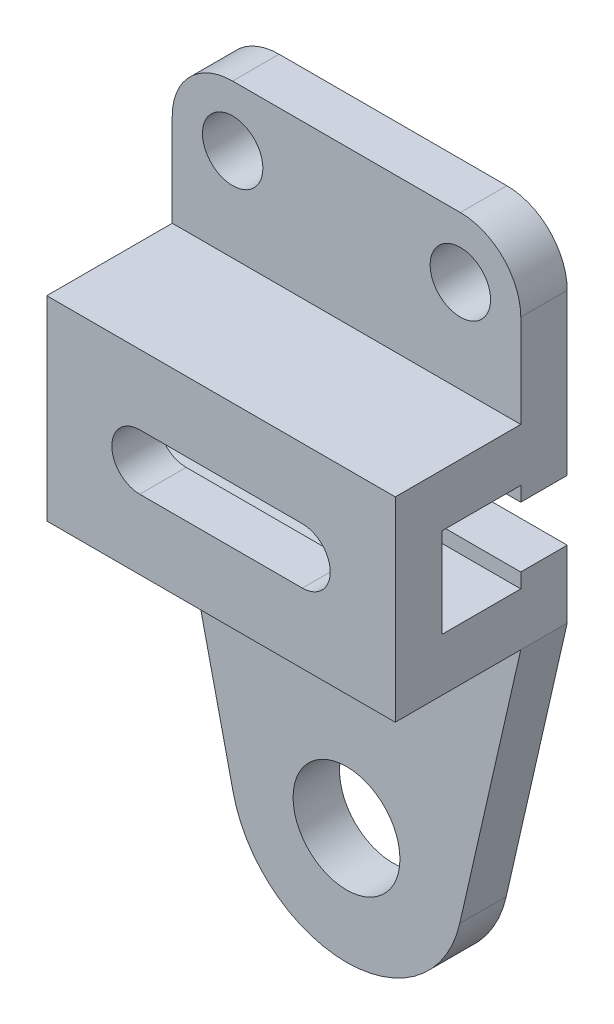
ISO-10303-21;
HEADER;
FILE_DESCRIPTION(('STEP AP214'),'2;1');
FILE_NAME('part.step','',(''),(''),'','','');
FILE_SCHEMA(('AUTOMOTIVE_DESIGN { 1 0 10303 214 1 1 1 1 }'));
ENDSEC;
DATA;
#1=APPLICATION_CONTEXT('core data for automotive mechanical design processes');
#2=APPLICATION_PROTOCOL_DEFINITION('international standard','automotive_design',2000,#1);
#3=PRODUCT_CONTEXT('',#1,'mechanical');
#4=PRODUCT('Part','Part','',(#3));
#5=PRODUCT_RELATED_PRODUCT_CATEGORY('part','',(#4));
#6=PRODUCT_DEFINITION_FORMATION('','',#4);
#7=PRODUCT_DEFINITION_CONTEXT('part definition',#1,'design');
#8=PRODUCT_DEFINITION('design','',#6,#7);
#9=PRODUCT_DEFINITION_SHAPE('','',#8);
#10=(LENGTH_UNIT() NAMED_UNIT(*) SI_UNIT(.MILLI.,.METRE.));
#11=(NAMED_UNIT(*) PLANE_ANGLE_UNIT() SI_UNIT($,.RADIAN.));
#12=(NAMED_UNIT(*) SI_UNIT($,.STERADIAN.) SOLID_ANGLE_UNIT());
#13=UNCERTAINTY_MEASURE_WITH_UNIT(LENGTH_MEASURE(1.E-05),#10,'distance_accuracy_value','');
#14=(GEOMETRIC_REPRESENTATION_CONTEXT(3) GLOBAL_UNCERTAINTY_ASSIGNED_CONTEXT((#13)) GLOBAL_UNIT_ASSIGNED_CONTEXT((#10,
#11,#12)) REPRESENTATION_CONTEXT('',''));
#15=CARTESIAN_POINT('',(0.,0.,0.));
#16=DIRECTION('',(0.,0.,1.));
#17=DIRECTION('',(1.,0.,0.));
#18=AXIS2_PLACEMENT_3D('',#15,#16,#17);
#19=CARTESIAN_POINT('',(37.5,-98.,-8.49999999999997));
#20=DIRECTION('',(0.,0.,-1.));
#21=DIRECTION('',(-1.,0.,0.));
#22=AXIS2_PLACEMENT_3D('',#19,#20,#21);
#23=PLANE('',#22);
#24=CARTESIAN_POINT('',(0.,-73.,-8.49999999999997));
#25=DIRECTION('',(0.,0.,-1.));
#26=DIRECTION('',(-1.,0.,0.));
#27=AXIS2_PLACEMENT_3D('',#24,#25,#26);
#28=CIRCLE('',#27,11.5);
#29=CARTESIAN_POINT('',(-11.5,-73.,-8.49999999999997));
#30=VERTEX_POINT('',#29);
#31=EDGE_CURVE('E423',#30,#30,#28,.T.);
#32=ORIENTED_EDGE('',*,*,#31,.T.);
#33=EDGE_LOOP('',(#32));
#34=FACE_BOUND('',#33,.T.);
#35=DIRECTION('',(-0.222334462281461,0.974970454363625,0.));
#36=VECTOR('',#35,1.);
#37=CARTESIAN_POINT('',(-17.1013000743849,-110.451403668259,-8.49999999999997));
#38=LINE('',#37,#36);
#39=CARTESIAN_POINT('',(-24.3742613590906,-78.5583615570365,-8.49999999999997));
#40=VERTEX_POINT('',#39);
#41=CARTESIAN_POINT('',(-37.5,-21.,-8.49999999999997));
#42=VERTEX_POINT('',#41);
#43=EDGE_CURVE('E12',#40,#42,#38,.T.);
#44=ORIENTED_EDGE('',*,*,#43,.F.);
#45=CARTESIAN_POINT('',(0.,-73.,-8.49999999999997));
#46=DIRECTION('',(0.,0.,-1.));
#47=DIRECTION('',(-1.,0.,0.));
#48=AXIS2_PLACEMENT_3D('',#45,#46,#47);
#49=CIRCLE('',#48,25.);
#50=CARTESIAN_POINT('',(24.3742613590906,-78.5583615570365,-8.49999999999997));
#51=VERTEX_POINT('',#50);
#52=EDGE_CURVE('E161',#51,#40,#49,.T.);
#53=ORIENTED_EDGE('',*,*,#52,.F.);
#54=DIRECTION('',(0.22233446228146,0.974970454363625,0.));
#55=VECTOR('',#54,1.);
#56=CARTESIAN_POINT('',(20.8087460582339,-94.1936887899151,-8.49999999999997));
#57=LINE('',#56,#55);
#58=CARTESIAN_POINT('',(37.5,-21.,-8.49999999999997));
#59=VERTEX_POINT('',#58);
#60=EDGE_CURVE('E397',#51,#59,#57,.T.);
#61=ORIENTED_EDGE('',*,*,#60,.T.);
#62=DIRECTION('',(-1.,0.,0.));
#63=VECTOR('',#62,1.);
#64=CARTESIAN_POINT('',(37.5,-21.,-8.49999999999997));
#65=LINE('',#64,#63);
#66=EDGE_CURVE('E381',#59,#42,#65,.T.);
#67=ORIENTED_EDGE('',*,*,#66,.T.);
#68=EDGE_LOOP('',(#44,#53,#61,#67));
#69=FACE_BOUND('',#68,.T.);
#70=ADVANCED_FACE('F149',(#34,#69),#23,.F.);
#71=CARTESIAN_POINT('',(37.5,-21.,-18.5));
#72=DIRECTION('',(0.,0.,1.));
#73=DIRECTION('',(0.,-1.,0.));
#74=AXIS2_PLACEMENT_3D('',#71,#72,#73);
#75=PLANE('',#74);
#76=CARTESIAN_POINT('',(0.,-73.,-18.5000000000001));
#77=DIRECTION('',(0.,0.,1.));
#78=DIRECTION('',(1.,0.,0.));
#79=AXIS2_PLACEMENT_3D('',#76,#77,#78);
#80=CIRCLE('',#79,11.5);
#81=CARTESIAN_POINT('',(11.5,-73.,-18.5000000000001));
#82=VERTEX_POINT('',#81);
#83=EDGE_CURVE('E490',#82,#82,#80,.T.);
#84=ORIENTED_EDGE('',*,*,#83,.T.);
#85=EDGE_LOOP('',(#84));
#86=FACE_BOUND('',#85,.T.);
#87=CARTESIAN_POINT('',(0.,-73.,-18.5000000000001));
#88=DIRECTION('',(0.,0.,1.));
#89=DIRECTION('',(1.,0.,0.));
#90=AXIS2_PLACEMENT_3D('',#87,#88,#89);
#91=CIRCLE('',#90,25.);
#92=CARTESIAN_POINT('',(-24.3742613590906,-78.5583615570365,-18.5000000000001));
#93=VERTEX_POINT('',#92);
#94=CARTESIAN_POINT('',(24.3742613590906,-78.5583615570365,-18.5000000000001));
#95=VERTEX_POINT('',#94);
#96=EDGE_CURVE('E424',#93,#95,#91,.T.);
#97=ORIENTED_EDGE('',*,*,#96,.F.);
#98=DIRECTION('',(0.222334462281461,-0.974970454363625,0.));
#99=VECTOR('',#98,1.);
#100=CARTESIAN_POINT('',(-40.1984371740117,-9.16694231464952,-18.5000000000001));
#101=LINE('',#100,#99);
#102=CARTESIAN_POINT('',(-37.5,-21.,-18.5000000000001));
#103=VERTEX_POINT('',#102);
#104=EDGE_CURVE('E477',#103,#93,#101,.T.);
#105=ORIENTED_EDGE('',*,*,#104,.F.);
#106=DIRECTION('',(0.,1.,0.));
#107=VECTOR('',#106,1.);
#108=CARTESIAN_POINT('',(-37.5,-21.,-18.5));
#109=LINE('',#108,#107);
#110=CARTESIAN_POINT('',(-37.5,-6.5,-18.5000000000001));
#111=VERTEX_POINT('',#110);
#112=EDGE_CURVE('E342',#103,#111,#109,.T.);
#113=ORIENTED_EDGE('',*,*,#112,.T.);
#114=DIRECTION('',(-1.,0.,0.));
#115=VECTOR('',#114,1.);
#116=CARTESIAN_POINT('',(37.5,-6.5,-18.5000000000001));
#117=LINE('',#116,#115);
#118=CARTESIAN_POINT('',(37.5,-6.5,-18.5000000000001));
#119=VERTEX_POINT('',#118);
#120=EDGE_CURVE('E379',#119,#111,#117,.T.);
#121=ORIENTED_EDGE('',*,*,#120,.F.);
#122=DIRECTION('',(0.,1.,0.));
#123=VECTOR('',#122,1.);
#124=CARTESIAN_POINT('',(37.5,-21.,-18.5));
#125=LINE('',#124,#123);
#126=CARTESIAN_POINT('',(37.5,-21.,-18.5000000000001));
#127=VERTEX_POINT('',#126);
#128=EDGE_CURVE('E449',#127,#119,#125,.T.);
#129=ORIENTED_EDGE('',*,*,#128,.F.);
#130=DIRECTION('',(-0.22233446228146,-0.974970454363625,0.));
#131=VECTOR('',#130,1.);
#132=CARTESIAN_POINT('',(40.1984371740117,-9.1669423146495,-18.5000000000001));
#133=LINE('',#132,#131);
#134=EDGE_CURVE('E429',#127,#95,#133,.T.);
#135=ORIENTED_EDGE('',*,*,#134,.T.);
#136=EDGE_LOOP('',(#97,#105,#113,#121,#129,#135));
#137=FACE_BOUND('',#136,.T.);
#138=ADVANCED_FACE('F518',(#86,#137),#75,.F.);
#139=CARTESIAN_POINT('',(37.5,54.,-18.5));
#140=DIRECTION('',(0.,0.,1.));
#141=DIRECTION('',(1.,0.,0.));
#142=AXIS2_PLACEMENT_3D('',#139,#140,#141);
#143=PLANE('',#142);
#144=CARTESIAN_POINT('',(-24.5,41.,-18.5000000000001));
#145=DIRECTION('',(0.,0.,1.));
#146=DIRECTION('',(1.,0.,0.));
#147=AXIS2_PLACEMENT_3D('',#144,#145,#146);
#148=CIRCLE('',#147,6.5);
#149=CARTESIAN_POINT('',(-18.,41.,-18.5000000000001));
#150=VERTEX_POINT('',#149);
#151=EDGE_CURVE('E480',#150,#150,#148,.F.);
#152=ORIENTED_EDGE('',*,*,#151,.F.);
#153=EDGE_LOOP('',(#152));
#154=FACE_BOUND('',#153,.T.);
#155=CARTESIAN_POINT('',(24.5,41.,-18.5000000000001));
#156=DIRECTION('',(0.,0.,1.));
#157=DIRECTION('',(1.,0.,0.));
#158=AXIS2_PLACEMENT_3D('',#155,#156,#157);
#159=CIRCLE('',#158,6.5);
#160=CARTESIAN_POINT('',(31.,41.,-18.5000000000001));
#161=VERTEX_POINT('',#160);
#162=EDGE_CURVE('E492',#161,#161,#159,.T.);
#163=ORIENTED_EDGE('',*,*,#162,.T.);
#164=EDGE_LOOP('',(#163));
#165=FACE_BOUND('',#164,.T.);
#166=CARTESIAN_POINT('',(24.5,41.,-18.5000000000001));
#167=DIRECTION('',(0.,0.,1.));
#168=DIRECTION('',(1.,0.,0.));
#169=AXIS2_PLACEMENT_3D('',#166,#167,#168);
#170=CIRCLE('',#169,13.);
#171=CARTESIAN_POINT('',(37.5,41.,-18.5000000000001));
#172=VERTEX_POINT('',#171);
#173=CARTESIAN_POINT('',(24.5,54.,-18.5000000000001));
#174=VERTEX_POINT('',#173);
#175=EDGE_CURVE('E469',#172,#174,#170,.T.);
#176=ORIENTED_EDGE('',*,*,#175,.F.);
#177=DIRECTION('',(0.,1.,0.));
#178=VECTOR('',#177,1.);
#179=CARTESIAN_POINT('',(37.5,6.5,-18.5000000000001));
#180=LINE('',#179,#178);
#181=CARTESIAN_POINT('',(37.5,6.5,-18.5000000000001));
#182=VERTEX_POINT('',#181);
#183=EDGE_CURVE('E359',#182,#172,#180,.T.);
#184=ORIENTED_EDGE('',*,*,#183,.F.);
#185=DIRECTION('',(-1.,0.,0.));
#186=VECTOR('',#185,1.);
#187=CARTESIAN_POINT('',(37.5,6.5,-18.5000000000001));
#188=LINE('',#187,#186);
#189=CARTESIAN_POINT('',(-37.5,6.5,-18.5000000000001));
#190=VERTEX_POINT('',#189);
#191=EDGE_CURVE('E329',#182,#190,#188,.T.);
#192=ORIENTED_EDGE('',*,*,#191,.T.);
#193=DIRECTION('',(0.,1.,0.));
#194=VECTOR('',#193,1.);
#195=CARTESIAN_POINT('',(-37.5,54.,-18.5));
#196=LINE('',#195,#194);
#197=CARTESIAN_POINT('',(-37.5,41.,-18.5000000000001));
#198=VERTEX_POINT('',#197);
#199=EDGE_CURVE('E317',#190,#198,#196,.T.);
#200=ORIENTED_EDGE('',*,*,#199,.T.);
#201=CARTESIAN_POINT('',(-24.5,41.,-18.5000000000001));
#202=DIRECTION('',(0.,0.,1.));
#203=DIRECTION('',(1.,0.,0.));
#204=AXIS2_PLACEMENT_3D('',#201,#202,#203);
#205=CIRCLE('',#204,13.);
#206=CARTESIAN_POINT('',(-24.5,54.,-18.5000000000001));
#207=VERTEX_POINT('',#206);
#208=EDGE_CURVE('E301',#198,#207,#205,.F.);
#209=ORIENTED_EDGE('',*,*,#208,.T.);
#210=DIRECTION('',(-1.,0.,0.));
#211=VECTOR('',#210,1.);
#212=CARTESIAN_POINT('',(37.5,54.,-18.5));
#213=LINE('',#212,#211);
#214=EDGE_CURVE('E396',#174,#207,#213,.T.);
#215=ORIENTED_EDGE('',*,*,#214,.F.);
#216=EDGE_LOOP('',(#176,#184,#192,#200,#209,#215));
#217=FACE_BOUND('',#216,.T.);
#218=ADVANCED_FACE('F148',(#154,#165,#217),#143,.F.);
#219=CARTESIAN_POINT('',(37.5,54.,-8.49999999999997));
#220=DIRECTION('',(0.,-1.,0.));
#221=DIRECTION('',(0.,0.,-1.));
#222=AXIS2_PLACEMENT_3D('',#219,#220,#221);
#223=PLANE('',#222);
#224=DIRECTION('',(0.,0.,1.));
#225=VECTOR('',#224,1.);
#226=CARTESIAN_POINT('',(24.5,54.,-18.5000000000001));
#227=LINE('',#226,#225);
#228=CARTESIAN_POINT('',(24.5,54.,-8.49999999999997));
#229=VERTEX_POINT('',#228);
#230=EDGE_CURVE('E173',#174,#229,#227,.T.);
#231=ORIENTED_EDGE('',*,*,#230,.F.);
#232=ORIENTED_EDGE('',*,*,#214,.T.);
#233=DIRECTION('',(0.,0.,1.));
#234=VECTOR('',#233,1.);
#235=CARTESIAN_POINT('',(-24.5,54.,-18.5000000000001));
#236=LINE('',#235,#234);
#237=CARTESIAN_POINT('',(-24.5,54.,-8.49999999999997));
#238=VERTEX_POINT('',#237);
#239=EDGE_CURVE('E309',#207,#238,#236,.T.);
#240=ORIENTED_EDGE('',*,*,#239,.T.);
#241=DIRECTION('',(-1.,0.,0.));
#242=VECTOR('',#241,1.);
#243=CARTESIAN_POINT('',(37.5,54.,-8.49999999999997));
#244=LINE('',#243,#242);
#245=EDGE_CURVE('E394',#229,#238,#244,.T.);
#246=ORIENTED_EDGE('',*,*,#245,.F.);
#247=EDGE_LOOP('',(#231,#232,#240,#246));
#248=FACE_BOUND('',#247,.T.);
#249=ADVANCED_FACE('F519',(#248),#223,.F.);
#250=CARTESIAN_POINT('',(37.5,21.,-8.49999999999997));
#251=DIRECTION('',(0.,0.,-1.));
#252=DIRECTION('',(-1.,0.,0.));
#253=AXIS2_PLACEMENT_3D('',#250,#251,#252);
#254=PLANE('',#253);
#255=CARTESIAN_POINT('',(24.5,41.,-8.49999999999997));
#256=DIRECTION('',(0.,0.,-1.));
#257=DIRECTION('',(-1.,0.,0.));
#258=AXIS2_PLACEMENT_3D('',#255,#256,#257);
#259=CIRCLE('',#258,6.5);
#260=CARTESIAN_POINT('',(18.,41.,-8.49999999999997));
#261=VERTEX_POINT('',#260);
#262=EDGE_CURVE('E414',#261,#261,#259,.T.);
#263=ORIENTED_EDGE('',*,*,#262,.T.);
#264=EDGE_LOOP('',(#263));
#265=FACE_BOUND('',#264,.T.);
#266=CARTESIAN_POINT('',(24.5,41.,-8.49999999999997));
#267=DIRECTION('',(0.,0.,-1.));
#268=DIRECTION('',(-1.,0.,0.));
#269=AXIS2_PLACEMENT_3D('',#266,#267,#268);
#270=CIRCLE('',#269,13.);
#271=CARTESIAN_POINT('',(37.5,41.,-8.49999999999997));
#272=VERTEX_POINT('',#271);
#273=EDGE_CURVE('E157',#229,#272,#270,.T.);
#274=ORIENTED_EDGE('',*,*,#273,.F.);
#275=ORIENTED_EDGE('',*,*,#245,.T.);
#276=CARTESIAN_POINT('',(-24.5,41.,-8.49999999999997));
#277=DIRECTION('',(0.,0.,-1.));
#278=DIRECTION('',(-1.,0.,0.));
#279=AXIS2_PLACEMENT_3D('',#276,#277,#278);
#280=CIRCLE('',#279,13.);
#281=CARTESIAN_POINT('',(-37.5,41.,-8.49999999999997));
#282=VERTEX_POINT('',#281);
#283=EDGE_CURVE('E416',#238,#282,#280,.F.);
#284=ORIENTED_EDGE('',*,*,#283,.T.);
#285=DIRECTION('',(0.,-1.,0.));
#286=VECTOR('',#285,1.);
#287=CARTESIAN_POINT('',(-37.5,21.,-8.49999999999997));
#288=LINE('',#287,#286);
#289=CARTESIAN_POINT('',(-37.5,21.,-8.49999999999997));
#290=VERTEX_POINT('',#289);
#291=EDGE_CURVE('E325',#282,#290,#288,.T.);
#292=ORIENTED_EDGE('',*,*,#291,.T.);
#293=DIRECTION('',(-1.,0.,0.));
#294=VECTOR('',#293,1.);
#295=CARTESIAN_POINT('',(37.5,21.,-8.49999999999997));
#296=LINE('',#295,#294);
#297=CARTESIAN_POINT('',(37.5,21.,-8.49999999999997));
#298=VERTEX_POINT('',#297);
#299=EDGE_CURVE('E392',#298,#290,#296,.T.);
#300=ORIENTED_EDGE('',*,*,#299,.F.);
#301=DIRECTION('',(0.,-1.,0.));
#302=VECTOR('',#301,1.);
#303=CARTESIAN_POINT('',(37.5,21.,-8.49999999999997));
#304=LINE('',#303,#302);
#305=EDGE_CURVE('E443',#272,#298,#304,.T.);
#306=ORIENTED_EDGE('',*,*,#305,.F.);
#307=EDGE_LOOP('',(#274,#275,#284,#292,#300,#306));
#308=FACE_BOUND('',#307,.T.);
#309=CARTESIAN_POINT('',(-24.5,41.,-8.49999999999997));
#310=DIRECTION('',(0.,0.,-1.));
#311=DIRECTION('',(-1.,0.,0.));
#312=AXIS2_PLACEMENT_3D('',#309,#310,#311);
#313=CIRCLE('',#312,6.5);
#314=CARTESIAN_POINT('',(-31.,41.,-8.49999999999997));
#315=VERTEX_POINT('',#314);
#316=EDGE_CURVE('E419',#315,#315,#313,.F.);
#317=ORIENTED_EDGE('',*,*,#316,.F.);
#318=EDGE_LOOP('',(#317));
#319=FACE_BOUND('',#318,.T.);
#320=ADVANCED_FACE('F524',(#265,#308,#319),#254,.F.);
#321=CARTESIAN_POINT('',(-37.5,0.,0.));
#322=DIRECTION('',(-1.,0.,0.));
#323=DIRECTION('',(0.,0.,1.));
#324=AXIS2_PLACEMENT_3D('',#321,#322,#323);
#325=PLANE('',#324);
#326=DIRECTION('',(0.,0.,1.));
#327=VECTOR('',#326,1.);
#328=CARTESIAN_POINT('',(-37.5,41.,-18.5000000000001));
#329=LINE('',#328,#327);
#330=EDGE_CURVE('E308',#198,#282,#329,.T.);
#331=ORIENTED_EDGE('',*,*,#330,.F.);
#332=ORIENTED_EDGE('',*,*,#199,.F.);
#333=DIRECTION('',(0.,0.,-1.));
#334=VECTOR('',#333,1.);
#335=CARTESIAN_POINT('',(-37.5,6.5,-8.49999999999991));
#336=LINE('',#335,#334);
#337=CARTESIAN_POINT('',(-37.5,6.5,-8.49999999999991));
#338=VERTEX_POINT('',#337);
#339=EDGE_CURVE('E358',#338,#190,#336,.T.);
#340=ORIENTED_EDGE('',*,*,#339,.F.);
#341=DIRECTION('',(0.,-1.,0.));
#342=VECTOR('',#341,1.);
#343=CARTESIAN_POINT('',(-37.5,6.5,-8.49999999999991));
#344=LINE('',#343,#342);
#345=CARTESIAN_POINT('',(-37.5,9.64864864864867,-8.49999999999997));
#346=VERTEX_POINT('',#345);
#347=EDGE_CURVE('E356',#346,#338,#344,.T.);
#348=ORIENTED_EDGE('',*,*,#347,.F.);
#349=DIRECTION('',(0.,0.,-1.));
#350=VECTOR('',#349,1.);
#351=CARTESIAN_POINT('',(-37.5,9.64864864864867,8.49999999999997));
#352=LINE('',#351,#350);
#353=CARTESIAN_POINT('',(-37.5,9.64864864864867,8.49999999999997));
#354=VERTEX_POINT('',#353);
#355=EDGE_CURVE('E354',#354,#346,#352,.T.);
#356=ORIENTED_EDGE('',*,*,#355,.F.);
#357=DIRECTION('',(0.,1.,0.));
#358=VECTOR('',#357,1.);
#359=CARTESIAN_POINT('',(-37.5,-9.64864864864868,8.49999999999997));
#360=LINE('',#359,#358);
#361=CARTESIAN_POINT('',(-37.5,-9.64864864864868,8.49999999999997));
#362=VERTEX_POINT('',#361);
#363=EDGE_CURVE('E355',#362,#354,#360,.T.);
#364=ORIENTED_EDGE('',*,*,#363,.F.);
#365=DIRECTION('',(0.,0.,1.));
#366=VECTOR('',#365,1.);
#367=CARTESIAN_POINT('',(-37.5,-9.64864864864868,8.49999999999997));
#368=LINE('',#367,#366);
#369=CARTESIAN_POINT('',(-37.5,-9.64864864864868,-8.49999999999997));
#370=VERTEX_POINT('',#369);
#371=EDGE_CURVE('E349',#370,#362,#368,.T.);
#372=ORIENTED_EDGE('',*,*,#371,.F.);
#373=DIRECTION('',(0.,-1.,0.));
#374=VECTOR('',#373,1.);
#375=CARTESIAN_POINT('',(-37.5,-9.64864864864868,-8.49999999999997));
#376=LINE('',#375,#374);
#377=CARTESIAN_POINT('',(-37.5,-6.5,-8.49999999999991));
#378=VERTEX_POINT('',#377);
#379=EDGE_CURVE('E346',#378,#370,#376,.T.);
#380=ORIENTED_EDGE('',*,*,#379,.F.);
#381=DIRECTION('',(0.,0.,1.));
#382=VECTOR('',#381,1.);
#383=CARTESIAN_POINT('',(-37.5,-6.5,-8.49999999999991));
#384=LINE('',#383,#382);
#385=EDGE_CURVE('E348',#111,#378,#384,.T.);
#386=ORIENTED_EDGE('',*,*,#385,.F.);
#387=ORIENTED_EDGE('',*,*,#112,.F.);
#388=DIRECTION('',(0.,0.,1.));
#389=VECTOR('',#388,1.);
#390=CARTESIAN_POINT('',(-37.5,-21.,-18.5000000000001));
#391=LINE('',#390,#389);
#392=EDGE_CURVE('E485',#103,#42,#391,.T.);
#393=ORIENTED_EDGE('',*,*,#392,.T.);
#394=DIRECTION('',(0.,0.,-1.));
#395=VECTOR('',#394,1.);
#396=CARTESIAN_POINT('',(-37.5,-21.,18.5));
#397=LINE('',#396,#395);
#398=CARTESIAN_POINT('',(-37.5,-21.,18.5));
#399=VERTEX_POINT('',#398);
#400=EDGE_CURVE('E343',#399,#42,#397,.T.);
#401=ORIENTED_EDGE('',*,*,#400,.F.);
#402=DIRECTION('',(0.,-1.,0.));
#403=VECTOR('',#402,1.);
#404=CARTESIAN_POINT('',(-37.5,-21.,18.5));
#405=LINE('',#404,#403);
#406=CARTESIAN_POINT('',(-37.5,21.,18.5));
#407=VERTEX_POINT('',#406);
#408=EDGE_CURVE('E339',#407,#399,#405,.T.);
#409=ORIENTED_EDGE('',*,*,#408,.F.);
#410=DIRECTION('',(0.,0.,1.));
#411=VECTOR('',#410,1.);
#412=CARTESIAN_POINT('',(-37.5,21.,18.5));
#413=LINE('',#412,#411);
#414=EDGE_CURVE('E328',#290,#407,#413,.T.);
#415=ORIENTED_EDGE('',*,*,#414,.F.);
#416=ORIENTED_EDGE('',*,*,#291,.F.);
#417=EDGE_LOOP('',(#331,#332,#340,#348,#356,#364,#372,#380,#386,#387,#393,#401,#409,#415,#416));
#418=FACE_BOUND('',#417,.T.);
#419=ADVANCED_FACE('F320',(#418),#325,.T.);
#420=CARTESIAN_POINT('',(37.5,0.,0.));
#421=DIRECTION('',(-1.,0.,0.));
#422=DIRECTION('',(0.,0.,1.));
#423=AXIS2_PLACEMENT_3D('',#420,#421,#422);
#424=PLANE('',#423);
#425=ORIENTED_EDGE('',*,*,#183,.T.);
#426=DIRECTION('',(0.,0.,1.));
#427=VECTOR('',#426,1.);
#428=CARTESIAN_POINT('',(37.5,41.,-18.5000000000001));
#429=LINE('',#428,#427);
#430=EDGE_CURVE('E472',#172,#272,#429,.T.);
#431=ORIENTED_EDGE('',*,*,#430,.T.);
#432=ORIENTED_EDGE('',*,*,#305,.T.);
#433=DIRECTION('',(0.,0.,1.));
#434=VECTOR('',#433,1.);
#435=CARTESIAN_POINT('',(37.5,21.,18.5));
#436=LINE('',#435,#434);
#437=CARTESIAN_POINT('',(37.5,21.,18.5));
#438=VERTEX_POINT('',#437);
#439=EDGE_CURVE('E441',#298,#438,#436,.T.);
#440=ORIENTED_EDGE('',*,*,#439,.T.);
#441=DIRECTION('',(0.,-1.,0.));
#442=VECTOR('',#441,1.);
#443=CARTESIAN_POINT('',(37.5,-21.,18.5));
#444=LINE('',#443,#442);
#445=CARTESIAN_POINT('',(37.5,-21.,18.5));
#446=VERTEX_POINT('',#445);
#447=EDGE_CURVE('E442',#438,#446,#444,.T.);
#448=ORIENTED_EDGE('',*,*,#447,.T.);
#449=DIRECTION('',(0.,0.,-1.));
#450=VECTOR('',#449,1.);
#451=CARTESIAN_POINT('',(37.5,-21.,18.5));
#452=LINE('',#451,#450);
#453=EDGE_CURVE('E450',#446,#59,#452,.T.);
#454=ORIENTED_EDGE('',*,*,#453,.T.);
#455=DIRECTION('',(0.,0.,1.));
#456=VECTOR('',#455,1.);
#457=CARTESIAN_POINT('',(37.5,-21.,-18.5000000000001));
#458=LINE('',#457,#456);
#459=EDGE_CURVE('E438',#127,#59,#458,.T.);
#460=ORIENTED_EDGE('',*,*,#459,.F.);
#461=ORIENTED_EDGE('',*,*,#128,.T.);
#462=DIRECTION('',(0.,0.,1.));
#463=VECTOR('',#462,1.);
#464=CARTESIAN_POINT('',(37.5,-6.5,-8.49999999999991));
#465=LINE('',#464,#463);
#466=CARTESIAN_POINT('',(37.5,-6.5,-8.49999999999991));
#467=VERTEX_POINT('',#466);
#468=EDGE_CURVE('E455',#119,#467,#465,.T.);
#469=ORIENTED_EDGE('',*,*,#468,.T.);
#470=DIRECTION('',(0.,-1.,0.));
#471=VECTOR('',#470,1.);
#472=CARTESIAN_POINT('',(37.5,-9.64864864864868,-8.49999999999997));
#473=LINE('',#472,#471);
#474=CARTESIAN_POINT('',(37.5,-9.64864864864868,-8.49999999999997));
#475=VERTEX_POINT('',#474);
#476=EDGE_CURVE('E452',#467,#475,#473,.T.);
#477=ORIENTED_EDGE('',*,*,#476,.T.);
#478=DIRECTION('',(0.,0.,1.));
#479=VECTOR('',#478,1.);
#480=CARTESIAN_POINT('',(37.5,-9.64864864864868,8.49999999999997));
#481=LINE('',#480,#479);
#482=CARTESIAN_POINT('',(37.5,-9.64864864864868,8.49999999999997));
#483=VERTEX_POINT('',#482);
#484=EDGE_CURVE('E456',#475,#483,#481,.T.);
#485=ORIENTED_EDGE('',*,*,#484,.T.);
#486=DIRECTION('',(0.,1.,0.));
#487=VECTOR('',#486,1.);
#488=CARTESIAN_POINT('',(37.5,-9.64864864864868,8.49999999999997));
#489=LINE('',#488,#487);
#490=CARTESIAN_POINT('',(37.5,9.64864864864867,8.49999999999997));
#491=VERTEX_POINT('',#490);
#492=EDGE_CURVE('E457',#483,#491,#489,.T.);
#493=ORIENTED_EDGE('',*,*,#492,.T.);
#494=DIRECTION('',(0.,0.,-1.));
#495=VECTOR('',#494,1.);
#496=CARTESIAN_POINT('',(37.5,9.64864864864867,8.49999999999997));
#497=LINE('',#496,#495);
#498=CARTESIAN_POINT('',(37.5,9.64864864864867,-8.49999999999997));
#499=VERTEX_POINT('',#498);
#500=EDGE_CURVE('E459',#491,#499,#497,.T.);
#501=ORIENTED_EDGE('',*,*,#500,.T.);
#502=DIRECTION('',(0.,-1.,0.));
#503=VECTOR('',#502,1.);
#504=CARTESIAN_POINT('',(37.5,6.5,-8.49999999999991));
#505=LINE('',#504,#503);
#506=CARTESIAN_POINT('',(37.5,6.5,-8.49999999999991));
#507=VERTEX_POINT('',#506);
#508=EDGE_CURVE('E462',#499,#507,#505,.T.);
#509=ORIENTED_EDGE('',*,*,#508,.T.);
#510=DIRECTION('',(0.,0.,-1.));
#511=VECTOR('',#510,1.);
#512=CARTESIAN_POINT('',(37.5,6.5,-8.49999999999991));
#513=LINE('',#512,#511);
#514=EDGE_CURVE('E334',#507,#182,#513,.T.);
#515=ORIENTED_EDGE('',*,*,#514,.T.);
#516=EDGE_LOOP('',(#425,#431,#432,#440,#448,#454,#460,#461,#469,#477,#485,#493,#501,#509,#515));
#517=FACE_BOUND('',#516,.T.);
#518=ADVANCED_FACE('F468',(#517),#424,.F.);
#519=CARTESIAN_POINT('',(37.5,21.,18.5));
#520=DIRECTION('',(0.,-1.,0.));
#521=DIRECTION('',(0.,0.,-1.));
#522=AXIS2_PLACEMENT_3D('',#519,#520,#521);
#523=PLANE('',#522);
#524=ORIENTED_EDGE('',*,*,#414,.T.);
#525=DIRECTION('',(-1.,0.,0.));
#526=VECTOR('',#525,1.);
#527=CARTESIAN_POINT('',(37.5,21.,18.5));
#528=LINE('',#527,#526);
#529=EDGE_CURVE('E387',#438,#407,#528,.T.);
#530=ORIENTED_EDGE('',*,*,#529,.F.);
#531=ORIENTED_EDGE('',*,*,#439,.F.);
#532=ORIENTED_EDGE('',*,*,#299,.T.);
#533=EDGE_LOOP('',(#524,#530,#531,#532));
#534=FACE_BOUND('',#533,.T.);
#535=ADVANCED_FACE('F544',(#534),#523,.F.);
#536=CARTESIAN_POINT('',(37.5,-21.,18.5));
#537=DIRECTION('',(0.,0.,-1.));
#538=DIRECTION('',(-1.,0.,0.));
#539=AXIS2_PLACEMENT_3D('',#536,#537,#538);
#540=PLANE('',#539);
#541=CARTESIAN_POINT('',(17.5,0.,18.5));
#542=DIRECTION('',(0.,0.,1.));
#543=DIRECTION('',(1.,0.,0.));
#544=AXIS2_PLACEMENT_3D('',#541,#542,#543);
#545=CIRCLE('',#544,6.);
#546=CARTESIAN_POINT('',(17.5,-6.,18.5));
#547=VERTEX_POINT('',#546);
#548=CARTESIAN_POINT('',(17.5,6.00000000000001,18.5));
#549=VERTEX_POINT('',#548);
#550=EDGE_CURVE('E493',#547,#549,#545,.T.);
#551=ORIENTED_EDGE('',*,*,#550,.F.);
#552=DIRECTION('',(1.,0.,0.));
#553=VECTOR('',#552,1.);
#554=CARTESIAN_POINT('',(0.,-6.,18.5));
#555=LINE('',#554,#553);
#556=CARTESIAN_POINT('',(-17.5,-6.,18.5));
#557=VERTEX_POINT('',#556);
#558=EDGE_CURVE('E491',#557,#547,#555,.T.);
#559=ORIENTED_EDGE('',*,*,#558,.F.);
#560=CARTESIAN_POINT('',(-17.5,0.,18.5));
#561=DIRECTION('',(0.,0.,1.));
#562=DIRECTION('',(1.,0.,0.));
#563=AXIS2_PLACEMENT_3D('',#560,#561,#562);
#564=CIRCLE('',#563,6.);
#565=CARTESIAN_POINT('',(-17.5,6.,18.5));
#566=VERTEX_POINT('',#565);
#567=EDGE_CURVE('E499',#566,#557,#564,.T.);
#568=ORIENTED_EDGE('',*,*,#567,.F.);
#569=DIRECTION('',(1.,0.,0.));
#570=VECTOR('',#569,1.);
#571=CARTESIAN_POINT('',(0.,6.00000000000001,18.5));
#572=LINE('',#571,#570);
#573=EDGE_CURVE('E500',#566,#549,#572,.T.);
#574=ORIENTED_EDGE('',*,*,#573,.T.);
#575=EDGE_LOOP('',(#551,#559,#568,#574));
#576=FACE_BOUND('',#575,.T.);
#577=ORIENTED_EDGE('',*,*,#408,.T.);
#578=DIRECTION('',(-1.,0.,0.));
#579=VECTOR('',#578,1.);
#580=CARTESIAN_POINT('',(37.5,-21.,18.5));
#581=LINE('',#580,#579);
#582=EDGE_CURVE('E388',#446,#399,#581,.T.);
#583=ORIENTED_EDGE('',*,*,#582,.F.);
#584=ORIENTED_EDGE('',*,*,#447,.F.);
#585=ORIENTED_EDGE('',*,*,#529,.T.);
#586=EDGE_LOOP('',(#577,#583,#584,#585));
#587=FACE_BOUND('',#586,.T.);
#588=ADVANCED_FACE('F541',(#576,#587),#540,.F.);
#589=CARTESIAN_POINT('',(37.5,-21.,18.5));
#590=DIRECTION('',(0.,1.,0.));
#591=DIRECTION('',(0.,0.,1.));
#592=AXIS2_PLACEMENT_3D('',#589,#590,#591);
#593=PLANE('',#592);
#594=ORIENTED_EDGE('',*,*,#400,.T.);
#595=ORIENTED_EDGE('',*,*,#66,.F.);
#596=ORIENTED_EDGE('',*,*,#453,.F.);
#597=ORIENTED_EDGE('',*,*,#582,.T.);
#598=EDGE_LOOP('',(#594,#595,#596,#597));
#599=FACE_BOUND('',#598,.T.);
#600=ADVANCED_FACE('F540',(#599),#593,.F.);
#601=CARTESIAN_POINT('',(37.5,-6.5,-8.49999999999991));
#602=DIRECTION('',(0.,-1.,0.));
#603=DIRECTION('',(0.,0.,-1.));
#604=AXIS2_PLACEMENT_3D('',#601,#602,#603);
#605=PLANE('',#604);
#606=ORIENTED_EDGE('',*,*,#385,.T.);
#607=DIRECTION('',(-1.,0.,0.));
#608=VECTOR('',#607,1.);
#609=CARTESIAN_POINT('',(37.5,-6.5,-8.49999999999991));
#610=LINE('',#609,#608);
#611=EDGE_CURVE('E380',#467,#378,#610,.T.);
#612=ORIENTED_EDGE('',*,*,#611,.F.);
#613=ORIENTED_EDGE('',*,*,#468,.F.);
#614=ORIENTED_EDGE('',*,*,#120,.T.);
#615=EDGE_LOOP('',(#606,#612,#613,#614));
#616=FACE_BOUND('',#615,.T.);
#617=ADVANCED_FACE('F539',(#616),#605,.F.);
#618=CARTESIAN_POINT('',(37.5,-9.64864864864868,-8.49999999999997));
#619=DIRECTION('',(0.,0.,-1.));
#620=DIRECTION('',(0.,1.,0.));
#621=AXIS2_PLACEMENT_3D('',#618,#619,#620);
#622=PLANE('',#621);
#623=ORIENTED_EDGE('',*,*,#379,.T.);
#624=DIRECTION('',(-1.,0.,0.));
#625=VECTOR('',#624,1.);
#626=CARTESIAN_POINT('',(37.5,-9.64864864864868,-8.49999999999997));
#627=LINE('',#626,#625);
#628=EDGE_CURVE('E371',#475,#370,#627,.T.);
#629=ORIENTED_EDGE('',*,*,#628,.F.);
#630=ORIENTED_EDGE('',*,*,#476,.F.);
#631=ORIENTED_EDGE('',*,*,#611,.T.);
#632=EDGE_LOOP('',(#623,#629,#630,#631));
#633=FACE_BOUND('',#632,.T.);
#634=ADVANCED_FACE('F594',(#633),#622,.F.);
#635=CARTESIAN_POINT('',(37.5,-9.64864864864868,8.49999999999997));
#636=DIRECTION('',(0.,-1.,0.));
#637=DIRECTION('',(0.,0.,-1.));
#638=AXIS2_PLACEMENT_3D('',#635,#636,#637);
#639=PLANE('',#638);
#640=ORIENTED_EDGE('',*,*,#371,.T.);
#641=DIRECTION('',(-1.,0.,0.));
#642=VECTOR('',#641,1.);
#643=CARTESIAN_POINT('',(37.5,-9.64864864864868,8.49999999999997));
#644=LINE('',#643,#642);
#645=EDGE_CURVE('E372',#483,#362,#644,.T.);
#646=ORIENTED_EDGE('',*,*,#645,.F.);
#647=ORIENTED_EDGE('',*,*,#484,.F.);
#648=ORIENTED_EDGE('',*,*,#628,.T.);
#649=EDGE_LOOP('',(#640,#646,#647,#648));
#650=FACE_BOUND('',#649,.T.);
#651=ADVANCED_FACE('F599',(#650),#639,.F.);
#652=CARTESIAN_POINT('',(37.5,-9.64864864864868,8.49999999999997));
#653=DIRECTION('',(0.,0.,1.));
#654=DIRECTION('',(1.,0.,0.));
#655=AXIS2_PLACEMENT_3D('',#652,#653,#654);
#656=PLANE('',#655);
#657=CARTESIAN_POINT('',(-17.5,0.,8.49999999999997));
#658=DIRECTION('',(0.,0.,1.));
#659=DIRECTION('',(1.,0.,0.));
#660=AXIS2_PLACEMENT_3D('',#657,#658,#659);
#661=CIRCLE('',#660,6.);
#662=CARTESIAN_POINT('',(-17.5,6.,8.49999999999997));
#663=VERTEX_POINT('',#662);
#664=CARTESIAN_POINT('',(-17.5,-6.,8.49999999999997));
#665=VERTEX_POINT('',#664);
#666=EDGE_CURVE('E407',#663,#665,#661,.T.);
#667=ORIENTED_EDGE('',*,*,#666,.T.);
#668=DIRECTION('',(1.,0.,0.));
#669=VECTOR('',#668,1.);
#670=CARTESIAN_POINT('',(37.5,-6.,8.49999999999997));
#671=LINE('',#670,#669);
#672=CARTESIAN_POINT('',(17.5,-6.,8.49999999999997));
#673=VERTEX_POINT('',#672);
#674=EDGE_CURVE('E415',#665,#673,#671,.T.);
#675=ORIENTED_EDGE('',*,*,#674,.T.);
#676=CARTESIAN_POINT('',(17.5,0.,8.49999999999997));
#677=DIRECTION('',(0.,0.,1.));
#678=DIRECTION('',(1.,0.,0.));
#679=AXIS2_PLACEMENT_3D('',#676,#677,#678);
#680=CIRCLE('',#679,6.);
#681=CARTESIAN_POINT('',(17.5,6.00000000000001,8.49999999999997));
#682=VERTEX_POINT('',#681);
#683=EDGE_CURVE('E403',#673,#682,#680,.T.);
#684=ORIENTED_EDGE('',*,*,#683,.T.);
#685=DIRECTION('',(1.,0.,0.));
#686=VECTOR('',#685,1.);
#687=CARTESIAN_POINT('',(37.5,6.00000000000001,8.49999999999997));
#688=LINE('',#687,#686);
#689=EDGE_CURVE('E406',#663,#682,#688,.T.);
#690=ORIENTED_EDGE('',*,*,#689,.F.);
#691=EDGE_LOOP('',(#667,#675,#684,#690));
#692=FACE_BOUND('',#691,.T.);
#693=ORIENTED_EDGE('',*,*,#363,.T.);
#694=DIRECTION('',(-1.,0.,0.));
#695=VECTOR('',#694,1.);
#696=CARTESIAN_POINT('',(37.5,9.64864864864867,8.49999999999997));
#697=LINE('',#696,#695);
#698=EDGE_CURVE('E367',#491,#354,#697,.T.);
#699=ORIENTED_EDGE('',*,*,#698,.F.);
#700=ORIENTED_EDGE('',*,*,#492,.F.);
#701=ORIENTED_EDGE('',*,*,#645,.T.);
#702=EDGE_LOOP('',(#693,#699,#700,#701));
#703=FACE_BOUND('',#702,.T.);
#704=ADVANCED_FACE('F601',(#692,#703),#656,.F.);
#705=CARTESIAN_POINT('',(37.5,9.64864864864867,8.49999999999997));
#706=DIRECTION('',(0.,1.,0.));
#707=DIRECTION('',(0.,0.,1.));
#708=AXIS2_PLACEMENT_3D('',#705,#706,#707);
#709=PLANE('',#708);
#710=ORIENTED_EDGE('',*,*,#355,.T.);
#711=DIRECTION('',(-1.,0.,0.));
#712=VECTOR('',#711,1.);
#713=CARTESIAN_POINT('',(37.5,9.64864864864867,-8.49999999999997));
#714=LINE('',#713,#712);
#715=EDGE_CURVE('E364',#499,#346,#714,.T.);
#716=ORIENTED_EDGE('',*,*,#715,.F.);
#717=ORIENTED_EDGE('',*,*,#500,.F.);
#718=ORIENTED_EDGE('',*,*,#698,.T.);
#719=EDGE_LOOP('',(#710,#716,#717,#718));
#720=FACE_BOUND('',#719,.T.);
#721=ADVANCED_FACE('F610',(#720),#709,.F.);
#722=CARTESIAN_POINT('',(37.5,6.5,-8.49999999999991));
#723=DIRECTION('',(0.,0.,-1.));
#724=DIRECTION('',(0.,1.,0.));
#725=AXIS2_PLACEMENT_3D('',#722,#723,#724);
#726=PLANE('',#725);
#727=ORIENTED_EDGE('',*,*,#347,.T.);
#728=DIRECTION('',(-1.,0.,0.));
#729=VECTOR('',#728,1.);
#730=CARTESIAN_POINT('',(37.5,6.5,-8.49999999999991));
#731=LINE('',#730,#729);
#732=EDGE_CURVE('E365',#507,#338,#731,.T.);
#733=ORIENTED_EDGE('',*,*,#732,.F.);
#734=ORIENTED_EDGE('',*,*,#508,.F.);
#735=ORIENTED_EDGE('',*,*,#715,.T.);
#736=EDGE_LOOP('',(#727,#733,#734,#735));
#737=FACE_BOUND('',#736,.T.);
#738=ADVANCED_FACE('F613',(#737),#726,.F.);
#739=CARTESIAN_POINT('',(37.5,6.5,-8.49999999999991));
#740=DIRECTION('',(0.,1.,0.));
#741=DIRECTION('',(0.,0.,1.));
#742=AXIS2_PLACEMENT_3D('',#739,#740,#741);
#743=PLANE('',#742);
#744=ORIENTED_EDGE('',*,*,#339,.T.);
#745=ORIENTED_EDGE('',*,*,#191,.F.);
#746=ORIENTED_EDGE('',*,*,#514,.F.);
#747=ORIENTED_EDGE('',*,*,#732,.T.);
#748=EDGE_LOOP('',(#744,#745,#746,#747));
#749=FACE_BOUND('',#748,.T.);
#750=ADVANCED_FACE('F467',(#749),#743,.F.);
#751=CARTESIAN_POINT('',(40.1984371740117,-9.1669423146495,-18.5000000000001));
#752=DIRECTION('',(-0.974970454363625,0.22233446228146,0.));
#753=DIRECTION('',(-0.22233446228146,-0.974970454363625,0.));
#754=AXIS2_PLACEMENT_3D('',#751,#752,#753);
#755=PLANE('',#754);
#756=DIRECTION('',(0.,0.,1.));
#757=VECTOR('',#756,1.);
#758=CARTESIAN_POINT('',(24.3742613590906,-78.5583615570365,-18.5000000000001));
#759=LINE('',#758,#757);
#760=EDGE_CURVE('E335',#95,#51,#759,.T.);
#761=ORIENTED_EDGE('',*,*,#760,.F.);
#762=ORIENTED_EDGE('',*,*,#134,.F.);
#763=ORIENTED_EDGE('',*,*,#459,.T.);
#764=ORIENTED_EDGE('',*,*,#60,.F.);
#765=EDGE_LOOP('',(#761,#762,#763,#764));
#766=FACE_BOUND('',#765,.T.);
#767=ADVANCED_FACE('F580',(#766),#755,.F.);
#768=CARTESIAN_POINT('',(0.,-73.,-18.5000000000001));
#769=DIRECTION('',(0.,0.,1.));
#770=DIRECTION('',(1.,0.,0.));
#771=AXIS2_PLACEMENT_3D('',#768,#769,#770);
#772=CYLINDRICAL_SURFACE('',#771,25.);
#773=ORIENTED_EDGE('',*,*,#52,.T.);
#774=DIRECTION('',(0.,0.,1.));
#775=VECTOR('',#774,1.);
#776=CARTESIAN_POINT('',(-24.3742613590906,-78.5583615570365,-18.5000000000001));
#777=LINE('',#776,#775);
#778=EDGE_CURVE('E482',#93,#40,#777,.T.);
#779=ORIENTED_EDGE('',*,*,#778,.F.);
#780=ORIENTED_EDGE('',*,*,#96,.T.);
#781=ORIENTED_EDGE('',*,*,#760,.T.);
#782=EDGE_LOOP('',(#773,#779,#780,#781));
#783=FACE_BOUND('',#782,.T.);
#784=ADVANCED_FACE('F576',(#783),#772,.T.);
#785=CARTESIAN_POINT('',(0.,-6.,-18.5000000000001));
#786=DIRECTION('',(0.,-1.,0.));
#787=DIRECTION('',(1.,0.,0.));
#788=AXIS2_PLACEMENT_3D('',#785,#786,#787);
#789=PLANE('',#788);
#790=DIRECTION('',(0.,0.,1.));
#791=VECTOR('',#790,1.);
#792=CARTESIAN_POINT('',(-17.5,-6.,-18.5000000000001));
#793=LINE('',#792,#791);
#794=EDGE_CURVE('E481',#665,#557,#793,.T.);
#795=ORIENTED_EDGE('',*,*,#794,.T.);
#796=ORIENTED_EDGE('',*,*,#558,.T.);
#797=DIRECTION('',(0.,0.,1.));
#798=VECTOR('',#797,1.);
#799=CARTESIAN_POINT('',(17.5,-6.,-18.5000000000001));
#800=LINE('',#799,#798);
#801=EDGE_CURVE('E502',#673,#547,#800,.T.);
#802=ORIENTED_EDGE('',*,*,#801,.F.);
#803=ORIENTED_EDGE('',*,*,#674,.F.);
#804=EDGE_LOOP('',(#795,#796,#802,#803));
#805=FACE_BOUND('',#804,.T.);
#806=ADVANCED_FACE('F719',(#805),#789,.F.);
#807=CARTESIAN_POINT('',(-17.5,0.,-18.5000000000001));
#808=DIRECTION('',(0.,0.,1.));
#809=DIRECTION('',(1.,0.,0.));
#810=AXIS2_PLACEMENT_3D('',#807,#808,#809);
#811=CYLINDRICAL_SURFACE('',#810,6.);
#812=DIRECTION('',(0.,0.,1.));
#813=VECTOR('',#812,1.);
#814=CARTESIAN_POINT('',(-17.5,6.,-18.5000000000001));
#815=LINE('',#814,#813);
#816=EDGE_CURVE('E504',#663,#566,#815,.T.);
#817=ORIENTED_EDGE('',*,*,#816,.T.);
#818=ORIENTED_EDGE('',*,*,#567,.T.);
#819=ORIENTED_EDGE('',*,*,#794,.F.);
#820=ORIENTED_EDGE('',*,*,#666,.F.);
#821=EDGE_LOOP('',(#817,#818,#819,#820));
#822=FACE_BOUND('',#821,.T.);
#823=ADVANCED_FACE('F735',(#822),#811,.F.);
#824=CARTESIAN_POINT('',(0.,6.00000000000001,-18.5000000000001));
#825=DIRECTION('',(0.,-1.,0.));
#826=DIRECTION('',(1.,0.,0.));
#827=AXIS2_PLACEMENT_3D('',#824,#825,#826);
#828=PLANE('',#827);
#829=ORIENTED_EDGE('',*,*,#689,.T.);
#830=DIRECTION('',(0.,0.,1.));
#831=VECTOR('',#830,1.);
#832=CARTESIAN_POINT('',(17.5,6.00000000000001,-18.5000000000001));
#833=LINE('',#832,#831);
#834=EDGE_CURVE('E510',#682,#549,#833,.T.);
#835=ORIENTED_EDGE('',*,*,#834,.T.);
#836=ORIENTED_EDGE('',*,*,#573,.F.);
#837=ORIENTED_EDGE('',*,*,#816,.F.);
#838=EDGE_LOOP('',(#829,#835,#836,#837));
#839=FACE_BOUND('',#838,.T.);
#840=ADVANCED_FACE('F745',(#839),#828,.T.);
#841=CARTESIAN_POINT('',(17.5,0.,-18.5000000000001));
#842=DIRECTION('',(0.,0.,1.));
#843=DIRECTION('',(1.,0.,0.));
#844=AXIS2_PLACEMENT_3D('',#841,#842,#843);
#845=CYLINDRICAL_SURFACE('',#844,6.);
#846=ORIENTED_EDGE('',*,*,#801,.T.);
#847=ORIENTED_EDGE('',*,*,#550,.T.);
#848=ORIENTED_EDGE('',*,*,#834,.F.);
#849=ORIENTED_EDGE('',*,*,#683,.F.);
#850=EDGE_LOOP('',(#846,#847,#848,#849));
#851=FACE_BOUND('',#850,.T.);
#852=ADVANCED_FACE('F752',(#851),#845,.F.);
#853=CARTESIAN_POINT('',(24.5,41.,-18.5000000000001));
#854=DIRECTION('',(0.,0.,1.));
#855=DIRECTION('',(1.,0.,0.));
#856=AXIS2_PLACEMENT_3D('',#853,#854,#855);
#857=CYLINDRICAL_SURFACE('',#856,6.5);
#858=ORIENTED_EDGE('',*,*,#162,.F.);
#859=EDGE_LOOP('',(#858));
#860=FACE_BOUND('',#859,.T.);
#861=ORIENTED_EDGE('',*,*,#262,.F.);
#862=EDGE_LOOP('',(#861));
#863=FACE_BOUND('',#862,.T.);
#864=ADVANCED_FACE('F765',(#860,#863),#857,.F.);
#865=CARTESIAN_POINT('',(-24.5,41.,-18.5000000000001));
#866=DIRECTION('',(0.,0.,1.));
#867=DIRECTION('',(1.,0.,0.));
#868=AXIS2_PLACEMENT_3D('',#865,#866,#867);
#869=CYLINDRICAL_SURFACE('',#868,13.);
#870=ORIENTED_EDGE('',*,*,#239,.F.);
#871=ORIENTED_EDGE('',*,*,#208,.F.);
#872=ORIENTED_EDGE('',*,*,#330,.T.);
#873=ORIENTED_EDGE('',*,*,#283,.F.);
#874=EDGE_LOOP('',(#870,#871,#872,#873));
#875=FACE_BOUND('',#874,.T.);
#876=ADVANCED_FACE('F304',(#875),#869,.T.);
#877=CARTESIAN_POINT('',(24.5,41.,-18.5000000000001));
#878=DIRECTION('',(0.,0.,1.));
#879=DIRECTION('',(1.,0.,0.));
#880=AXIS2_PLACEMENT_3D('',#877,#878,#879);
#881=CYLINDRICAL_SURFACE('',#880,13.);
#882=ORIENTED_EDGE('',*,*,#273,.T.);
#883=ORIENTED_EDGE('',*,*,#430,.F.);
#884=ORIENTED_EDGE('',*,*,#175,.T.);
#885=ORIENTED_EDGE('',*,*,#230,.T.);
#886=EDGE_LOOP('',(#882,#883,#884,#885));
#887=FACE_BOUND('',#886,.T.);
#888=ADVANCED_FACE('F565',(#887),#881,.T.);
#889=CARTESIAN_POINT('',(-24.5,41.,-18.5000000000001));
#890=DIRECTION('',(0.,0.,1.));
#891=DIRECTION('',(1.,0.,0.));
#892=AXIS2_PLACEMENT_3D('',#889,#890,#891);
#893=CYLINDRICAL_SURFACE('',#892,6.5);
#894=ORIENTED_EDGE('',*,*,#151,.T.);
#895=EDGE_LOOP('',(#894));
#896=FACE_BOUND('',#895,.T.);
#897=ORIENTED_EDGE('',*,*,#316,.T.);
#898=EDGE_LOOP('',(#897));
#899=FACE_BOUND('',#898,.T.);
#900=ADVANCED_FACE('F517',(#896,#899),#893,.F.);
#901=CARTESIAN_POINT('',(0.,-73.,-18.5000000000001));
#902=DIRECTION('',(0.,0.,1.));
#903=DIRECTION('',(1.,0.,0.));
#904=AXIS2_PLACEMENT_3D('',#901,#902,#903);
#905=CYLINDRICAL_SURFACE('',#904,11.5);
#906=ORIENTED_EDGE('',*,*,#83,.F.);
#907=EDGE_LOOP('',(#906));
#908=FACE_BOUND('',#907,.T.);
#909=ORIENTED_EDGE('',*,*,#31,.F.);
#910=EDGE_LOOP('',(#909));
#911=FACE_BOUND('',#910,.T.);
#912=ADVANCED_FACE('F797',(#908,#911),#905,.F.);
#913=CARTESIAN_POINT('',(-40.1984371740117,-9.16694231464952,-18.5000000000001));
#914=DIRECTION('',(-0.974970454363625,-0.222334462281461,0.));
#915=DIRECTION('',(0.222334462281461,-0.974970454363625,0.));
#916=AXIS2_PLACEMENT_3D('',#913,#914,#915);
#917=PLANE('',#916);
#918=ORIENTED_EDGE('',*,*,#43,.T.);
#919=ORIENTED_EDGE('',*,*,#392,.F.);
#920=ORIENTED_EDGE('',*,*,#104,.T.);
#921=ORIENTED_EDGE('',*,*,#778,.T.);
#922=EDGE_LOOP('',(#918,#919,#920,#921));
#923=FACE_BOUND('',#922,.T.);
#924=ADVANCED_FACE('F583',(#923),#917,.T.);
#925=CLOSED_SHELL('',(#70,#138,#218,#249,#320,#419,#518,#535,#588,#600,#617,#634,#651,#704,#721,
#738,#750,#767,#784,#806,#823,#840,#852,#864,#876,#888,#900,#912,#924));
#926=MANIFOLD_SOLID_BREP('B2',#925);
#927=ADVANCED_BREP_SHAPE_REPRESENTATION('',(#18,#926),#14);
#928=SHAPE_DEFINITION_REPRESENTATION(#9,#927);
ENDSEC;
END-ISO-10303-21;
